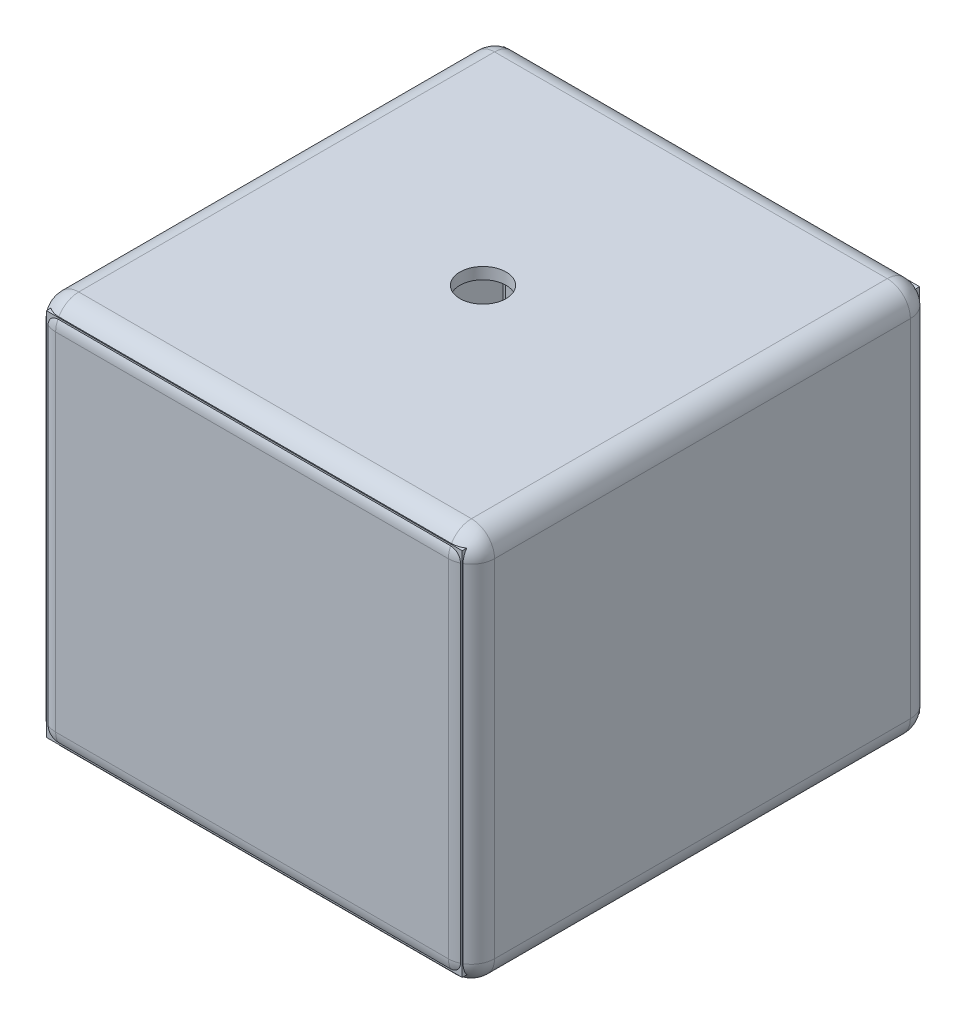
ISO-10303-21;
HEADER;
FILE_DESCRIPTION(('STEP AP214'),'2;1');
FILE_NAME('part.step','',(''),(''),'','','');
FILE_SCHEMA(('AUTOMOTIVE_DESIGN { 1 0 10303 214 1 1 1 1 }'));
ENDSEC;
DATA;
#1=APPLICATION_CONTEXT('core data for automotive mechanical design processes');
#2=APPLICATION_PROTOCOL_DEFINITION('international standard','automotive_design',2000,#1);
#3=PRODUCT_CONTEXT('',#1,'mechanical');
#4=PRODUCT('Part','Part','',(#3));
#5=PRODUCT_RELATED_PRODUCT_CATEGORY('part','',(#4));
#6=PRODUCT_DEFINITION_FORMATION('','',#4);
#7=PRODUCT_DEFINITION_CONTEXT('part definition',#1,'design');
#8=PRODUCT_DEFINITION('design','',#6,#7);
#9=PRODUCT_DEFINITION_SHAPE('','',#8);
#10=(LENGTH_UNIT() NAMED_UNIT(*) SI_UNIT(.MILLI.,.METRE.));
#11=(NAMED_UNIT(*) PLANE_ANGLE_UNIT() SI_UNIT($,.RADIAN.));
#12=(NAMED_UNIT(*) SI_UNIT($,.STERADIAN.) SOLID_ANGLE_UNIT());
#13=UNCERTAINTY_MEASURE_WITH_UNIT(LENGTH_MEASURE(1.E-05),#10,'distance_accuracy_value','');
#14=(GEOMETRIC_REPRESENTATION_CONTEXT(3) GLOBAL_UNCERTAINTY_ASSIGNED_CONTEXT((#13)) GLOBAL_UNIT_ASSIGNED_CONTEXT((#10,
#11,#12)) REPRESENTATION_CONTEXT('',''));
#15=CARTESIAN_POINT('',(0.,0.,0.));
#16=DIRECTION('',(0.,0.,1.));
#17=DIRECTION('',(1.,0.,0.));
#18=AXIS2_PLACEMENT_3D('',#15,#16,#17);
#19=CARTESIAN_POINT('',(95.,0.,200.));
#20=DIRECTION('',(-1.,0.,0.));
#21=DIRECTION('',(0.,0.,1.));
#22=AXIS2_PLACEMENT_3D('',#19,#20,#21);
#23=PLANE('',#22);
#24=DIRECTION('',(0.,0.,-1.));
#25=VECTOR('',#24,1.);
#26=CARTESIAN_POINT('',(95.,75.,200.));
#27=LINE('',#26,#25);
#28=CARTESIAN_POINT('',(95.,75.,10.));
#29=VERTEX_POINT('',#28);
#30=CARTESIAN_POINT('',(95.,75.,190.));
#31=VERTEX_POINT('',#30);
#32=EDGE_CURVE('E189',#29,#31,#27,.F.);
#33=ORIENTED_EDGE('',*,*,#32,.T.);
#34=DIRECTION('',(0.,1.,0.));
#35=VECTOR('',#34,1.);
#36=CARTESIAN_POINT('',(95.,-85.,190.));
#37=LINE('',#36,#35);
#38=CARTESIAN_POINT('',(95.,-75.,190.));
#39=VERTEX_POINT('',#38);
#40=EDGE_CURVE('E192',#31,#39,#37,.F.);
#41=ORIENTED_EDGE('',*,*,#40,.T.);
#42=DIRECTION('',(0.,0.,-1.));
#43=VECTOR('',#42,1.);
#44=CARTESIAN_POINT('',(95.,-75.,200.));
#45=LINE('',#44,#43);
#46=CARTESIAN_POINT('',(95.,-75.,10.));
#47=VERTEX_POINT('',#46);
#48=EDGE_CURVE('E187',#39,#47,#45,.T.);
#49=ORIENTED_EDGE('',*,*,#48,.T.);
#50=DIRECTION('',(0.,1.,0.));
#51=VECTOR('',#50,1.);
#52=CARTESIAN_POINT('',(95.,0.,10.));
#53=LINE('',#52,#51);
#54=EDGE_CURVE('E185',#47,#29,#53,.T.);
#55=ORIENTED_EDGE('',*,*,#54,.T.);
#56=EDGE_LOOP('',(#33,#41,#49,#55));
#57=FACE_BOUND('',#56,.T.);
#58=ADVANCED_FACE('F33',(#57),#23,.F.);
#59=CARTESIAN_POINT('',(0.,85.,200.));
#60=DIRECTION('',(0.,-1.,0.));
#61=DIRECTION('',(0.,0.,-1.));
#62=AXIS2_PLACEMENT_3D('',#59,#60,#61);
#63=PLANE('',#62);
#64=CARTESIAN_POINT('',(0.,85.,100.));
#65=DIRECTION('',(0.,1.,0.));
#66=DIRECTION('',(0.,0.,1.));
#67=AXIS2_PLACEMENT_3D('',#64,#65,#66);
#68=CIRCLE('',#67,10.);
#69=CARTESIAN_POINT('',(0.,85.,110.));
#70=VERTEX_POINT('',#69);
#71=EDGE_CURVE('E666',#70,#70,#68,.T.);
#72=ORIENTED_EDGE('',*,*,#71,.F.);
#73=EDGE_LOOP('',(#72));
#74=FACE_BOUND('',#73,.T.);
#75=DIRECTION('',(0.,0.,-1.));
#76=VECTOR('',#75,1.);
#77=CARTESIAN_POINT('',(-85.,85.,200.));
#78=LINE('',#77,#76);
#79=CARTESIAN_POINT('',(-85.,85.,10.));
#80=VERTEX_POINT('',#79);
#81=CARTESIAN_POINT('',(-85.,85.,190.));
#82=VERTEX_POINT('',#81);
#83=EDGE_CURVE('E173',#80,#82,#78,.F.);
#84=ORIENTED_EDGE('',*,*,#83,.T.);
#85=DIRECTION('',(-1.,0.,0.));
#86=VECTOR('',#85,1.);
#87=CARTESIAN_POINT('',(95.,85.,190.));
#88=LINE('',#87,#86);
#89=CARTESIAN_POINT('',(85.,85.,190.));
#90=VERTEX_POINT('',#89);
#91=EDGE_CURVE('E183',#82,#90,#88,.F.);
#92=ORIENTED_EDGE('',*,*,#91,.T.);
#93=DIRECTION('',(0.,0.,-1.));
#94=VECTOR('',#93,1.);
#95=CARTESIAN_POINT('',(85.,85.,200.));
#96=LINE('',#95,#94);
#97=CARTESIAN_POINT('',(85.,85.,10.));
#98=VERTEX_POINT('',#97);
#99=EDGE_CURVE('E180',#90,#98,#96,.T.);
#100=ORIENTED_EDGE('',*,*,#99,.T.);
#101=DIRECTION('',(-1.,0.,0.));
#102=VECTOR('',#101,1.);
#103=CARTESIAN_POINT('',(0.,85.,10.));
#104=LINE('',#103,#102);
#105=EDGE_CURVE('E170',#98,#80,#104,.T.);
#106=ORIENTED_EDGE('',*,*,#105,.T.);
#107=EDGE_LOOP('',(#84,#92,#100,#106));
#108=FACE_BOUND('',#107,.T.);
#109=ADVANCED_FACE('F321',(#74,#108),#63,.F.);
#110=CARTESIAN_POINT('',(-95.,0.,200.));
#111=DIRECTION('',(1.,0.,0.));
#112=DIRECTION('',(0.,0.,-1.));
#113=AXIS2_PLACEMENT_3D('',#110,#111,#112);
#114=PLANE('',#113);
#115=DIRECTION('',(0.,0.,-1.));
#116=VECTOR('',#115,1.);
#117=CARTESIAN_POINT('',(-95.,-75.,200.));
#118=LINE('',#117,#116);
#119=CARTESIAN_POINT('',(-95.,-75.,10.));
#120=VERTEX_POINT('',#119);
#121=CARTESIAN_POINT('',(-95.,-75.,190.));
#122=VERTEX_POINT('',#121);
#123=EDGE_CURVE('E205',#120,#122,#118,.F.);
#124=ORIENTED_EDGE('',*,*,#123,.T.);
#125=DIRECTION('',(0.,-1.,0.));
#126=VECTOR('',#125,1.);
#127=CARTESIAN_POINT('',(-95.,85.,190.));
#128=LINE('',#127,#126);
#129=CARTESIAN_POINT('',(-95.,75.,190.));
#130=VERTEX_POINT('',#129);
#131=EDGE_CURVE('E210',#122,#130,#128,.F.);
#132=ORIENTED_EDGE('',*,*,#131,.T.);
#133=DIRECTION('',(0.,0.,-1.));
#134=VECTOR('',#133,1.);
#135=CARTESIAN_POINT('',(-95.,75.,200.));
#136=LINE('',#135,#134);
#137=CARTESIAN_POINT('',(-95.,75.,10.));
#138=VERTEX_POINT('',#137);
#139=EDGE_CURVE('E207',#130,#138,#136,.T.);
#140=ORIENTED_EDGE('',*,*,#139,.T.);
#141=DIRECTION('',(0.,-1.,0.));
#142=VECTOR('',#141,1.);
#143=CARTESIAN_POINT('',(-95.,0.,10.));
#144=LINE('',#143,#142);
#145=EDGE_CURVE('E203',#138,#120,#144,.T.);
#146=ORIENTED_EDGE('',*,*,#145,.T.);
#147=EDGE_LOOP('',(#124,#132,#140,#146));
#148=FACE_BOUND('',#147,.T.);
#149=ADVANCED_FACE('F327',(#148),#114,.F.);
#150=CARTESIAN_POINT('',(0.,-85.,200.));
#151=DIRECTION('',(0.,1.,0.));
#152=DIRECTION('',(0.,0.,1.));
#153=AXIS2_PLACEMENT_3D('',#150,#151,#152);
#154=PLANE('',#153);
#155=DIRECTION('',(0.,0.,-1.));
#156=VECTOR('',#155,1.);
#157=CARTESIAN_POINT('',(85.,-85.,200.));
#158=LINE('',#157,#156);
#159=CARTESIAN_POINT('',(85.,-85.,10.));
#160=VERTEX_POINT('',#159);
#161=CARTESIAN_POINT('',(85.,-85.,190.));
#162=VERTEX_POINT('',#161);
#163=EDGE_CURVE('E198',#160,#162,#158,.F.);
#164=ORIENTED_EDGE('',*,*,#163,.T.);
#165=DIRECTION('',(1.,0.,0.));
#166=VECTOR('',#165,1.);
#167=CARTESIAN_POINT('',(-95.,-85.,190.));
#168=LINE('',#167,#166);
#169=CARTESIAN_POINT('',(-85.,-85.,190.));
#170=VERTEX_POINT('',#169);
#171=EDGE_CURVE('E201',#162,#170,#168,.F.);
#172=ORIENTED_EDGE('',*,*,#171,.T.);
#173=DIRECTION('',(0.,0.,-1.));
#174=VECTOR('',#173,1.);
#175=CARTESIAN_POINT('',(-85.,-85.,200.));
#176=LINE('',#175,#174);
#177=CARTESIAN_POINT('',(-85.,-85.,10.));
#178=VERTEX_POINT('',#177);
#179=EDGE_CURVE('E196',#170,#178,#176,.T.);
#180=ORIENTED_EDGE('',*,*,#179,.T.);
#181=DIRECTION('',(1.,0.,0.));
#182=VECTOR('',#181,1.);
#183=CARTESIAN_POINT('',(0.,-85.,10.));
#184=LINE('',#183,#182);
#185=EDGE_CURVE('E194',#178,#160,#184,.T.);
#186=ORIENTED_EDGE('',*,*,#185,.T.);
#187=EDGE_LOOP('',(#164,#172,#180,#186));
#188=FACE_BOUND('',#187,.T.);
#189=ADVANCED_FACE('F432',(#188),#154,.F.);
#190=CARTESIAN_POINT('',(0.,0.,200.));
#191=DIRECTION('',(0.,0.,1.));
#192=DIRECTION('',(1.,0.,0.));
#193=AXIS2_PLACEMENT_3D('',#190,#191,#192);
#194=PLANE('',#193);
#195=DIRECTION('',(0.,-1.,0.));
#196=VECTOR('',#195,1.);
#197=CARTESIAN_POINT('',(-85.,-85.,200.));
#198=LINE('',#197,#196);
#199=CARTESIAN_POINT('',(-85.,75.,200.));
#200=VERTEX_POINT('',#199);
#201=CARTESIAN_POINT('',(-85.,-75.,200.));
#202=VERTEX_POINT('',#201);
#203=EDGE_CURVE('E216',#200,#202,#198,.T.);
#204=ORIENTED_EDGE('',*,*,#203,.T.);
#205=DIRECTION('',(1.,0.,0.));
#206=VECTOR('',#205,1.);
#207=CARTESIAN_POINT('',(95.,-75.,200.));
#208=LINE('',#207,#206);
#209=CARTESIAN_POINT('',(85.,-75.,200.));
#210=VERTEX_POINT('',#209);
#211=EDGE_CURVE('E218',#202,#210,#208,.T.);
#212=ORIENTED_EDGE('',*,*,#211,.T.);
#213=DIRECTION('',(0.,1.,0.));
#214=VECTOR('',#213,1.);
#215=CARTESIAN_POINT('',(85.,85.,200.));
#216=LINE('',#215,#214);
#217=CARTESIAN_POINT('',(85.,75.,200.));
#218=VERTEX_POINT('',#217);
#219=EDGE_CURVE('E212',#210,#218,#216,.T.);
#220=ORIENTED_EDGE('',*,*,#219,.T.);
#221=DIRECTION('',(-1.,0.,0.));
#222=VECTOR('',#221,1.);
#223=CARTESIAN_POINT('',(-95.,75.,200.));
#224=LINE('',#223,#222);
#225=EDGE_CURVE('E214',#218,#200,#224,.T.);
#226=ORIENTED_EDGE('',*,*,#225,.T.);
#227=EDGE_LOOP('',(#204,#212,#220,#226));
#228=FACE_BOUND('',#227,.T.);
#229=ADVANCED_FACE('F441',(#228),#194,.T.);
#230=CARTESIAN_POINT('',(0.,0.,0.));
#231=DIRECTION('',(0.,0.,1.));
#232=DIRECTION('',(1.,0.,0.));
#233=AXIS2_PLACEMENT_3D('',#230,#231,#232);
#234=PLANE('',#233);
#235=DIRECTION('',(0.,-1.,0.));
#236=VECTOR('',#235,1.);
#237=CARTESIAN_POINT('',(-85.,0.,0.));
#238=LINE('',#237,#236);
#239=CARTESIAN_POINT('',(-85.,-75.,0.));
#240=VERTEX_POINT('',#239);
#241=CARTESIAN_POINT('',(-85.,75.,0.));
#242=VERTEX_POINT('',#241);
#243=EDGE_CURVE('E42',#240,#242,#238,.F.);
#244=ORIENTED_EDGE('',*,*,#243,.T.);
#245=DIRECTION('',(-1.,0.,0.));
#246=VECTOR('',#245,1.);
#247=CARTESIAN_POINT('',(0.,75.,0.));
#248=LINE('',#247,#246);
#249=CARTESIAN_POINT('',(85.,75.,0.));
#250=VERTEX_POINT('',#249);
#251=EDGE_CURVE('E11',#242,#250,#248,.F.);
#252=ORIENTED_EDGE('',*,*,#251,.T.);
#253=DIRECTION('',(0.,1.,0.));
#254=VECTOR('',#253,1.);
#255=CARTESIAN_POINT('',(85.,0.,0.));
#256=LINE('',#255,#254);
#257=CARTESIAN_POINT('',(85.,-75.,0.));
#258=VERTEX_POINT('',#257);
#259=EDGE_CURVE('E221',#250,#258,#256,.F.);
#260=ORIENTED_EDGE('',*,*,#259,.T.);
#261=DIRECTION('',(1.,0.,0.));
#262=VECTOR('',#261,1.);
#263=CARTESIAN_POINT('',(0.,-75.,0.));
#264=LINE('',#263,#262);
#265=EDGE_CURVE('E53',#258,#240,#264,.F.);
#266=ORIENTED_EDGE('',*,*,#265,.T.);
#267=EDGE_LOOP('',(#244,#252,#260,#266));
#268=FACE_BOUND('',#267,.T.);
#269=ADVANCED_FACE('F409',(#268),#234,.F.);
#270=CARTESIAN_POINT('',(-85.,-75.,200.));
#271=DIRECTION('',(0.,0.,-1.));
#272=DIRECTION('',(-1.,0.,0.));
#273=AXIS2_PLACEMENT_3D('',#270,#271,#272);
#274=CYLINDRICAL_SURFACE('',#273,10.);
#275=CARTESIAN_POINT('',(-85.,-75.,190.));
#276=DIRECTION('',(0.,0.,1.));
#277=DIRECTION('',(1.,0.,0.));
#278=AXIS2_PLACEMENT_3D('',#275,#276,#277);
#279=CIRCLE('',#278,10.);
#280=EDGE_CURVE('E287',#122,#170,#279,.T.);
#281=ORIENTED_EDGE('',*,*,#280,.F.);
#282=ORIENTED_EDGE('',*,*,#123,.F.);
#283=CARTESIAN_POINT('',(-85.,-75.,10.));
#284=DIRECTION('',(0.,0.,-1.));
#285=DIRECTION('',(-1.,0.,0.));
#286=AXIS2_PLACEMENT_3D('',#283,#284,#285);
#287=CIRCLE('',#286,10.);
#288=EDGE_CURVE('E285',#178,#120,#287,.T.);
#289=ORIENTED_EDGE('',*,*,#288,.F.);
#290=ORIENTED_EDGE('',*,*,#179,.F.);
#291=EDGE_LOOP('',(#281,#282,#289,#290));
#292=FACE_BOUND('',#291,.T.);
#293=ADVANCED_FACE('F35',(#292),#274,.T.);
#294=CARTESIAN_POINT('',(-85.,-75.,190.));
#295=DIRECTION('',(0.,0.,1.));
#296=DIRECTION('',(1.,0.,0.));
#297=AXIS2_PLACEMENT_3D('',#294,#295,#296);
#298=SPHERICAL_SURFACE('',#297,10.);
#299=CARTESIAN_POINT('',(-85.,-75.,190.));
#300=DIRECTION('',(0.,-1.,0.));
#301=DIRECTION('',(0.,0.,-1.));
#302=AXIS2_PLACEMENT_3D('',#299,#300,#301);
#303=CIRCLE('',#302,10.);
#304=EDGE_CURVE('E279',#122,#202,#303,.F.);
#305=ORIENTED_EDGE('',*,*,#304,.F.);
#306=ORIENTED_EDGE('',*,*,#280,.T.);
#307=CARTESIAN_POINT('',(-85.,-75.,190.));
#308=DIRECTION('',(-1.,0.,0.));
#309=DIRECTION('',(0.,0.,1.));
#310=AXIS2_PLACEMENT_3D('',#307,#308,#309);
#311=CIRCLE('',#310,10.);
#312=EDGE_CURVE('E282',#202,#170,#311,.F.);
#313=ORIENTED_EDGE('',*,*,#312,.F.);
#314=EDGE_LOOP('',(#305,#306,#313));
#315=FACE_BOUND('',#314,.T.);
#316=ADVANCED_FACE('F403',(#315),#298,.T.);
#317=CARTESIAN_POINT('',(-85.,-75.,10.));
#318=DIRECTION('',(0.,0.,1.));
#319=DIRECTION('',(1.,0.,0.));
#320=AXIS2_PLACEMENT_3D('',#317,#318,#319);
#321=SPHERICAL_SURFACE('',#320,10.);
#322=CARTESIAN_POINT('',(-85.,-75.,10.));
#323=DIRECTION('',(-1.,0.,0.));
#324=DIRECTION('',(0.,0.,1.));
#325=AXIS2_PLACEMENT_3D('',#322,#323,#324);
#326=CIRCLE('',#325,10.);
#327=EDGE_CURVE('E274',#178,#240,#326,.F.);
#328=ORIENTED_EDGE('',*,*,#327,.F.);
#329=ORIENTED_EDGE('',*,*,#288,.T.);
#330=CARTESIAN_POINT('',(-85.,-75.,10.));
#331=DIRECTION('',(0.,-1.,0.));
#332=DIRECTION('',(0.,0.,-1.));
#333=AXIS2_PLACEMENT_3D('',#330,#331,#332);
#334=CIRCLE('',#333,10.);
#335=EDGE_CURVE('E276',#240,#120,#334,.F.);
#336=ORIENTED_EDGE('',*,*,#335,.F.);
#337=EDGE_LOOP('',(#328,#329,#336));
#338=FACE_BOUND('',#337,.T.);
#339=ADVANCED_FACE('F400',(#338),#321,.T.);
#340=CARTESIAN_POINT('',(0.,-75.,190.));
#341=DIRECTION('',(-1.,0.,0.));
#342=DIRECTION('',(0.,0.,1.));
#343=AXIS2_PLACEMENT_3D('',#340,#341,#342);
#344=CYLINDRICAL_SURFACE('',#343,10.);
#345=ORIENTED_EDGE('',*,*,#312,.T.);
#346=ORIENTED_EDGE('',*,*,#171,.F.);
#347=CARTESIAN_POINT('',(85.,-75.,190.));
#348=DIRECTION('',(1.,0.,0.));
#349=DIRECTION('',(0.,0.,-1.));
#350=AXIS2_PLACEMENT_3D('',#347,#348,#349);
#351=CIRCLE('',#350,10.);
#352=EDGE_CURVE('E269',#210,#162,#351,.T.);
#353=ORIENTED_EDGE('',*,*,#352,.F.);
#354=ORIENTED_EDGE('',*,*,#211,.F.);
#355=EDGE_LOOP('',(#345,#346,#353,#354));
#356=FACE_BOUND('',#355,.T.);
#357=ADVANCED_FACE('F396',(#356),#344,.T.);
#358=CARTESIAN_POINT('',(-85.,0.,190.));
#359=DIRECTION('',(0.,1.,0.));
#360=DIRECTION('',(0.,0.,1.));
#361=AXIS2_PLACEMENT_3D('',#358,#359,#360);
#362=CYLINDRICAL_SURFACE('',#361,10.);
#363=ORIENTED_EDGE('',*,*,#304,.T.);
#364=ORIENTED_EDGE('',*,*,#203,.F.);
#365=CARTESIAN_POINT('',(-85.,75.,190.));
#366=DIRECTION('',(0.,1.,0.));
#367=DIRECTION('',(0.,0.,1.));
#368=AXIS2_PLACEMENT_3D('',#365,#366,#367);
#369=CIRCLE('',#368,10.);
#370=EDGE_CURVE('E266',#130,#200,#369,.T.);
#371=ORIENTED_EDGE('',*,*,#370,.F.);
#372=ORIENTED_EDGE('',*,*,#131,.F.);
#373=EDGE_LOOP('',(#363,#364,#371,#372));
#374=FACE_BOUND('',#373,.T.);
#375=ADVANCED_FACE('F392',(#374),#362,.T.);
#376=CARTESIAN_POINT('',(-85.,75.,200.));
#377=DIRECTION('',(0.,0.,-1.));
#378=DIRECTION('',(-1.,0.,0.));
#379=AXIS2_PLACEMENT_3D('',#376,#377,#378);
#380=CYLINDRICAL_SURFACE('',#379,10.);
#381=CARTESIAN_POINT('',(-85.,75.,10.));
#382=DIRECTION('',(0.,0.,-1.));
#383=DIRECTION('',(-1.,0.,0.));
#384=AXIS2_PLACEMENT_3D('',#381,#382,#383);
#385=CIRCLE('',#384,10.);
#386=EDGE_CURVE('E260',#138,#80,#385,.T.);
#387=ORIENTED_EDGE('',*,*,#386,.F.);
#388=ORIENTED_EDGE('',*,*,#139,.F.);
#389=CARTESIAN_POINT('',(-85.,75.,190.));
#390=DIRECTION('',(0.,0.,1.));
#391=DIRECTION('',(1.,0.,0.));
#392=AXIS2_PLACEMENT_3D('',#389,#390,#391);
#393=CIRCLE('',#392,10.);
#394=EDGE_CURVE('E263',#82,#130,#393,.T.);
#395=ORIENTED_EDGE('',*,*,#394,.F.);
#396=ORIENTED_EDGE('',*,*,#83,.F.);
#397=EDGE_LOOP('',(#387,#388,#395,#396));
#398=FACE_BOUND('',#397,.T.);
#399=ADVANCED_FACE('F388',(#398),#380,.T.);
#400=CARTESIAN_POINT('',(-85.,0.,10.));
#401=DIRECTION('',(0.,-1.,0.));
#402=DIRECTION('',(0.,0.,-1.));
#403=AXIS2_PLACEMENT_3D('',#400,#401,#402);
#404=CYLINDRICAL_SURFACE('',#403,10.);
#405=ORIENTED_EDGE('',*,*,#335,.T.);
#406=ORIENTED_EDGE('',*,*,#145,.F.);
#407=CARTESIAN_POINT('',(-85.,75.,10.));
#408=DIRECTION('',(0.,1.,0.));
#409=DIRECTION('',(0.,0.,1.));
#410=AXIS2_PLACEMENT_3D('',#407,#408,#409);
#411=CIRCLE('',#410,10.);
#412=EDGE_CURVE('E258',#242,#138,#411,.T.);
#413=ORIENTED_EDGE('',*,*,#412,.F.);
#414=ORIENTED_EDGE('',*,*,#243,.F.);
#415=EDGE_LOOP('',(#405,#406,#413,#414));
#416=FACE_BOUND('',#415,.T.);
#417=ADVANCED_FACE('F384',(#416),#404,.T.);
#418=CARTESIAN_POINT('',(0.,-75.,10.));
#419=DIRECTION('',(1.,0.,0.));
#420=DIRECTION('',(0.,0.,-1.));
#421=AXIS2_PLACEMENT_3D('',#418,#419,#420);
#422=CYLINDRICAL_SURFACE('',#421,10.);
#423=ORIENTED_EDGE('',*,*,#327,.T.);
#424=ORIENTED_EDGE('',*,*,#265,.F.);
#425=CARTESIAN_POINT('',(85.,-75.,10.));
#426=DIRECTION('',(1.,0.,0.));
#427=DIRECTION('',(0.,0.,-1.));
#428=AXIS2_PLACEMENT_3D('',#425,#426,#427);
#429=CIRCLE('',#428,10.);
#430=EDGE_CURVE('E255',#160,#258,#429,.T.);
#431=ORIENTED_EDGE('',*,*,#430,.F.);
#432=ORIENTED_EDGE('',*,*,#185,.F.);
#433=EDGE_LOOP('',(#423,#424,#431,#432));
#434=FACE_BOUND('',#433,.T.);
#435=ADVANCED_FACE('F380',(#434),#422,.T.);
#436=CARTESIAN_POINT('',(85.,-75.,200.));
#437=DIRECTION('',(0.,0.,-1.));
#438=DIRECTION('',(-1.,0.,0.));
#439=AXIS2_PLACEMENT_3D('',#436,#437,#438);
#440=CYLINDRICAL_SURFACE('',#439,10.);
#441=CARTESIAN_POINT('',(85.,-75.,190.));
#442=DIRECTION('',(0.,0.,1.));
#443=DIRECTION('',(1.,0.,0.));
#444=AXIS2_PLACEMENT_3D('',#441,#442,#443);
#445=CIRCLE('',#444,10.);
#446=EDGE_CURVE('E271',#162,#39,#445,.T.);
#447=ORIENTED_EDGE('',*,*,#446,.F.);
#448=ORIENTED_EDGE('',*,*,#163,.F.);
#449=CARTESIAN_POINT('',(85.,-75.,10.));
#450=DIRECTION('',(0.,0.,-1.));
#451=DIRECTION('',(-1.,0.,0.));
#452=AXIS2_PLACEMENT_3D('',#449,#450,#451);
#453=CIRCLE('',#452,10.);
#454=EDGE_CURVE('E252',#47,#160,#453,.T.);
#455=ORIENTED_EDGE('',*,*,#454,.F.);
#456=ORIENTED_EDGE('',*,*,#48,.F.);
#457=EDGE_LOOP('',(#447,#448,#455,#456));
#458=FACE_BOUND('',#457,.T.);
#459=ADVANCED_FACE('F376',(#458),#440,.T.);
#460=CARTESIAN_POINT('',(85.,-75.,190.));
#461=DIRECTION('',(0.,0.,1.));
#462=DIRECTION('',(1.,0.,0.));
#463=AXIS2_PLACEMENT_3D('',#460,#461,#462);
#464=SPHERICAL_SURFACE('',#463,10.);
#465=ORIENTED_EDGE('',*,*,#352,.T.);
#466=ORIENTED_EDGE('',*,*,#446,.T.);
#467=CARTESIAN_POINT('',(85.,-75.,190.));
#468=DIRECTION('',(0.,-1.,0.));
#469=DIRECTION('',(0.,0.,-1.));
#470=AXIS2_PLACEMENT_3D('',#467,#468,#469);
#471=CIRCLE('',#470,10.);
#472=EDGE_CURVE('E249',#210,#39,#471,.F.);
#473=ORIENTED_EDGE('',*,*,#472,.F.);
#474=EDGE_LOOP('',(#465,#466,#473));
#475=FACE_BOUND('',#474,.T.);
#476=ADVANCED_FACE('F372',(#475),#464,.T.);
#477=CARTESIAN_POINT('',(-85.,75.,190.));
#478=DIRECTION('',(0.,0.,1.));
#479=DIRECTION('',(1.,0.,0.));
#480=AXIS2_PLACEMENT_3D('',#477,#478,#479);
#481=SPHERICAL_SURFACE('',#480,10.);
#482=ORIENTED_EDGE('',*,*,#394,.T.);
#483=ORIENTED_EDGE('',*,*,#370,.T.);
#484=CARTESIAN_POINT('',(-85.,75.,190.));
#485=DIRECTION('',(-1.,0.,0.));
#486=DIRECTION('',(0.,0.,1.));
#487=AXIS2_PLACEMENT_3D('',#484,#485,#486);
#488=CIRCLE('',#487,10.);
#489=EDGE_CURVE('E246',#82,#200,#488,.F.);
#490=ORIENTED_EDGE('',*,*,#489,.F.);
#491=EDGE_LOOP('',(#482,#483,#490));
#492=FACE_BOUND('',#491,.T.);
#493=ADVANCED_FACE('F368',(#492),#481,.T.);
#494=CARTESIAN_POINT('',(-85.,75.,10.));
#495=DIRECTION('',(0.,0.,1.));
#496=DIRECTION('',(1.,0.,0.));
#497=AXIS2_PLACEMENT_3D('',#494,#495,#496);
#498=SPHERICAL_SURFACE('',#497,10.);
#499=ORIENTED_EDGE('',*,*,#412,.T.);
#500=ORIENTED_EDGE('',*,*,#386,.T.);
#501=CARTESIAN_POINT('',(-85.,75.,10.));
#502=DIRECTION('',(-1.,0.,0.));
#503=DIRECTION('',(0.,0.,1.));
#504=AXIS2_PLACEMENT_3D('',#501,#502,#503);
#505=CIRCLE('',#504,10.);
#506=EDGE_CURVE('E243',#242,#80,#505,.F.);
#507=ORIENTED_EDGE('',*,*,#506,.F.);
#508=EDGE_LOOP('',(#499,#500,#507));
#509=FACE_BOUND('',#508,.T.);
#510=ADVANCED_FACE('F364',(#509),#498,.T.);
#511=CARTESIAN_POINT('',(85.,-75.,10.));
#512=DIRECTION('',(0.,0.,1.));
#513=DIRECTION('',(1.,0.,0.));
#514=AXIS2_PLACEMENT_3D('',#511,#512,#513);
#515=SPHERICAL_SURFACE('',#514,10.);
#516=ORIENTED_EDGE('',*,*,#454,.T.);
#517=ORIENTED_EDGE('',*,*,#430,.T.);
#518=CARTESIAN_POINT('',(85.,-75.,10.));
#519=DIRECTION('',(0.,-1.,0.));
#520=DIRECTION('',(0.,0.,-1.));
#521=AXIS2_PLACEMENT_3D('',#518,#519,#520);
#522=CIRCLE('',#521,10.);
#523=EDGE_CURVE('E240',#47,#258,#522,.F.);
#524=ORIENTED_EDGE('',*,*,#523,.F.);
#525=EDGE_LOOP('',(#516,#517,#524));
#526=FACE_BOUND('',#525,.T.);
#527=ADVANCED_FACE('F360',(#526),#515,.T.);
#528=CARTESIAN_POINT('',(85.,0.,190.));
#529=DIRECTION('',(0.,-1.,0.));
#530=DIRECTION('',(0.,0.,-1.));
#531=AXIS2_PLACEMENT_3D('',#528,#529,#530);
#532=CYLINDRICAL_SURFACE('',#531,10.);
#533=ORIENTED_EDGE('',*,*,#472,.T.);
#534=ORIENTED_EDGE('',*,*,#40,.F.);
#535=CARTESIAN_POINT('',(85.,75.,190.));
#536=DIRECTION('',(0.,1.,0.));
#537=DIRECTION('',(0.,0.,1.));
#538=AXIS2_PLACEMENT_3D('',#535,#536,#537);
#539=CIRCLE('',#538,10.);
#540=EDGE_CURVE('E237',#218,#31,#539,.T.);
#541=ORIENTED_EDGE('',*,*,#540,.F.);
#542=ORIENTED_EDGE('',*,*,#219,.F.);
#543=EDGE_LOOP('',(#533,#534,#541,#542));
#544=FACE_BOUND('',#543,.T.);
#545=ADVANCED_FACE('F356',(#544),#532,.T.);
#546=CARTESIAN_POINT('',(0.,75.,190.));
#547=DIRECTION('',(1.,0.,0.));
#548=DIRECTION('',(0.,0.,-1.));
#549=AXIS2_PLACEMENT_3D('',#546,#547,#548);
#550=CYLINDRICAL_SURFACE('',#549,10.);
#551=ORIENTED_EDGE('',*,*,#489,.T.);
#552=ORIENTED_EDGE('',*,*,#225,.F.);
#553=CARTESIAN_POINT('',(85.,75.,190.));
#554=DIRECTION('',(1.,0.,0.));
#555=DIRECTION('',(0.,0.,-1.));
#556=AXIS2_PLACEMENT_3D('',#553,#554,#555);
#557=CIRCLE('',#556,10.);
#558=EDGE_CURVE('E234',#90,#218,#557,.T.);
#559=ORIENTED_EDGE('',*,*,#558,.F.);
#560=ORIENTED_EDGE('',*,*,#91,.F.);
#561=EDGE_LOOP('',(#551,#552,#559,#560));
#562=FACE_BOUND('',#561,.T.);
#563=ADVANCED_FACE('F352',(#562),#550,.T.);
#564=CARTESIAN_POINT('',(0.,75.,10.));
#565=DIRECTION('',(-1.,0.,0.));
#566=DIRECTION('',(0.,0.,1.));
#567=AXIS2_PLACEMENT_3D('',#564,#565,#566);
#568=CYLINDRICAL_SURFACE('',#567,10.);
#569=ORIENTED_EDGE('',*,*,#506,.T.);
#570=ORIENTED_EDGE('',*,*,#105,.F.);
#571=CARTESIAN_POINT('',(85.,75.,10.));
#572=DIRECTION('',(1.,0.,0.));
#573=DIRECTION('',(0.,0.,-1.));
#574=AXIS2_PLACEMENT_3D('',#571,#572,#573);
#575=CIRCLE('',#574,10.);
#576=EDGE_CURVE('E231',#250,#98,#575,.T.);
#577=ORIENTED_EDGE('',*,*,#576,.F.);
#578=ORIENTED_EDGE('',*,*,#251,.F.);
#579=EDGE_LOOP('',(#569,#570,#577,#578));
#580=FACE_BOUND('',#579,.T.);
#581=ADVANCED_FACE('F348',(#580),#568,.T.);
#582=CARTESIAN_POINT('',(85.,0.,10.));
#583=DIRECTION('',(0.,1.,0.));
#584=DIRECTION('',(0.,0.,1.));
#585=AXIS2_PLACEMENT_3D('',#582,#583,#584);
#586=CYLINDRICAL_SURFACE('',#585,10.);
#587=ORIENTED_EDGE('',*,*,#523,.T.);
#588=ORIENTED_EDGE('',*,*,#259,.F.);
#589=CARTESIAN_POINT('',(85.,75.,10.));
#590=DIRECTION('',(0.,1.,0.));
#591=DIRECTION('',(0.,0.,1.));
#592=AXIS2_PLACEMENT_3D('',#589,#590,#591);
#593=CIRCLE('',#592,10.);
#594=EDGE_CURVE('E229',#29,#250,#593,.T.);
#595=ORIENTED_EDGE('',*,*,#594,.F.);
#596=ORIENTED_EDGE('',*,*,#54,.F.);
#597=EDGE_LOOP('',(#587,#588,#595,#596));
#598=FACE_BOUND('',#597,.T.);
#599=ADVANCED_FACE('F344',(#598),#586,.T.);
#600=CARTESIAN_POINT('',(85.,75.,190.));
#601=DIRECTION('',(0.,0.,1.));
#602=DIRECTION('',(1.,0.,0.));
#603=AXIS2_PLACEMENT_3D('',#600,#601,#602);
#604=SPHERICAL_SURFACE('',#603,10.);
#605=ORIENTED_EDGE('',*,*,#558,.T.);
#606=ORIENTED_EDGE('',*,*,#540,.T.);
#607=CARTESIAN_POINT('',(85.,75.,190.));
#608=DIRECTION('',(0.,0.,1.));
#609=DIRECTION('',(1.,0.,0.));
#610=AXIS2_PLACEMENT_3D('',#607,#608,#609);
#611=CIRCLE('',#610,10.);
#612=EDGE_CURVE('E227',#90,#31,#611,.F.);
#613=ORIENTED_EDGE('',*,*,#612,.F.);
#614=EDGE_LOOP('',(#605,#606,#613));
#615=FACE_BOUND('',#614,.T.);
#616=ADVANCED_FACE('F340',(#615),#604,.T.);
#617=CARTESIAN_POINT('',(85.,75.,10.));
#618=DIRECTION('',(0.,0.,1.));
#619=DIRECTION('',(1.,0.,0.));
#620=AXIS2_PLACEMENT_3D('',#617,#618,#619);
#621=SPHERICAL_SURFACE('',#620,10.);
#622=ORIENTED_EDGE('',*,*,#594,.T.);
#623=ORIENTED_EDGE('',*,*,#576,.T.);
#624=CARTESIAN_POINT('',(85.,75.,10.));
#625=DIRECTION('',(0.,0.,-1.));
#626=DIRECTION('',(-1.,0.,0.));
#627=AXIS2_PLACEMENT_3D('',#624,#625,#626);
#628=CIRCLE('',#627,10.);
#629=EDGE_CURVE('E225',#29,#98,#628,.F.);
#630=ORIENTED_EDGE('',*,*,#629,.F.);
#631=EDGE_LOOP('',(#622,#623,#630));
#632=FACE_BOUND('',#631,.T.);
#633=ADVANCED_FACE('F336',(#632),#621,.T.);
#634=CARTESIAN_POINT('',(85.,75.,200.));
#635=DIRECTION('',(0.,0.,-1.));
#636=DIRECTION('',(-1.,0.,0.));
#637=AXIS2_PLACEMENT_3D('',#634,#635,#636);
#638=CYLINDRICAL_SURFACE('',#637,10.);
#639=ORIENTED_EDGE('',*,*,#612,.T.);
#640=ORIENTED_EDGE('',*,*,#32,.F.);
#641=ORIENTED_EDGE('',*,*,#629,.T.);
#642=ORIENTED_EDGE('',*,*,#99,.F.);
#643=EDGE_LOOP('',(#639,#640,#641,#642));
#644=FACE_BOUND('',#643,.T.);
#645=ADVANCED_FACE('F332',(#644),#638,.T.);
#646=CARTESIAN_POINT('',(0.,21.,100.));
#647=DIRECTION('',(0.,1.,0.));
#648=DIRECTION('',(0.,0.,1.));
#649=AXIS2_PLACEMENT_3D('',#646,#647,#648);
#650=CYLINDRICAL_SURFACE('',#649,10.);
#651=CARTESIAN_POINT('',(0.,80.,100.));
#652=DIRECTION('',(0.,-1.,0.));
#653=DIRECTION('',(0.,0.,-1.));
#654=AXIS2_PLACEMENT_3D('',#651,#652,#653);
#655=CIRCLE('',#654,10.);
#656=CARTESIAN_POINT('',(0.,80.,90.));
#657=VERTEX_POINT('',#656);
#658=EDGE_CURVE('E37',#657,#657,#655,.T.);
#659=ORIENTED_EDGE('',*,*,#658,.T.);
#660=EDGE_LOOP('',(#659));
#661=FACE_BOUND('',#660,.T.);
#662=ORIENTED_EDGE('',*,*,#71,.T.);
#663=EDGE_LOOP('',(#662));
#664=FACE_BOUND('',#663,.T.);
#665=ADVANCED_FACE('F335',(#661,#664),#650,.F.);
#666=CARTESIAN_POINT('',(90.,-80.,199.));
#667=DIRECTION('',(-1.,0.,0.));
#668=DIRECTION('',(0.,0.,1.));
#669=AXIS2_PLACEMENT_3D('',#666,#667,#668);
#670=PLANE('',#669);
#671=DIRECTION('',(0.,1.,0.));
#672=VECTOR('',#671,1.);
#673=CARTESIAN_POINT('',(90.,-80.,1.));
#674=LINE('',#673,#672);
#675=CARTESIAN_POINT('',(90.,-80.,1.));
#676=VERTEX_POINT('',#675);
#677=CARTESIAN_POINT('',(90.,80.,1.));
#678=VERTEX_POINT('',#677);
#679=EDGE_CURVE('E289',#676,#678,#674,.T.);
#680=ORIENTED_EDGE('',*,*,#679,.F.);
#681=DIRECTION('',(0.,0.,-1.));
#682=VECTOR('',#681,1.);
#683=CARTESIAN_POINT('',(90.,-80.,199.));
#684=LINE('',#683,#682);
#685=CARTESIAN_POINT('',(90.,-80.,199.));
#686=VERTEX_POINT('',#685);
#687=EDGE_CURVE('E165',#686,#676,#684,.T.);
#688=ORIENTED_EDGE('',*,*,#687,.F.);
#689=DIRECTION('',(0.,1.,0.));
#690=VECTOR('',#689,1.);
#691=CARTESIAN_POINT('',(90.,-80.,199.));
#692=LINE('',#691,#690);
#693=CARTESIAN_POINT('',(90.,80.,199.));
#694=VERTEX_POINT('',#693);
#695=EDGE_CURVE('E150',#686,#694,#692,.T.);
#696=ORIENTED_EDGE('',*,*,#695,.T.);
#697=DIRECTION('',(0.,0.,-1.));
#698=VECTOR('',#697,1.);
#699=CARTESIAN_POINT('',(90.,80.,199.));
#700=LINE('',#699,#698);
#701=EDGE_CURVE('E162',#694,#678,#700,.T.);
#702=ORIENTED_EDGE('',*,*,#701,.T.);
#703=EDGE_LOOP('',(#680,#688,#696,#702));
#704=FACE_BOUND('',#703,.T.);
#705=ADVANCED_FACE('F161',(#704),#670,.T.);
#706=CARTESIAN_POINT('',(-90.,80.,199.));
#707=DIRECTION('',(0.,-1.,0.));
#708=DIRECTION('',(0.,0.,-1.));
#709=AXIS2_PLACEMENT_3D('',#706,#707,#708);
#710=PLANE('',#709);
#711=ORIENTED_EDGE('',*,*,#658,.F.);
#712=EDGE_LOOP('',(#711));
#713=FACE_BOUND('',#712,.T.);
#714=DIRECTION('',(-1.,0.,0.));
#715=VECTOR('',#714,1.);
#716=CARTESIAN_POINT('',(-90.,80.,1.));
#717=LINE('',#716,#715);
#718=CARTESIAN_POINT('',(-90.,80.,1.));
#719=VERTEX_POINT('',#718);
#720=EDGE_CURVE('E169',#678,#719,#717,.T.);
#721=ORIENTED_EDGE('',*,*,#720,.F.);
#722=ORIENTED_EDGE('',*,*,#701,.F.);
#723=DIRECTION('',(-1.,0.,0.));
#724=VECTOR('',#723,1.);
#725=CARTESIAN_POINT('',(-90.,80.,199.));
#726=LINE('',#725,#724);
#727=CARTESIAN_POINT('',(-90.,80.,199.));
#728=VERTEX_POINT('',#727);
#729=EDGE_CURVE('E146',#694,#728,#726,.T.);
#730=ORIENTED_EDGE('',*,*,#729,.T.);
#731=DIRECTION('',(0.,0.,-1.));
#732=VECTOR('',#731,1.);
#733=CARTESIAN_POINT('',(-90.,80.,199.));
#734=LINE('',#733,#732);
#735=EDGE_CURVE('E171',#728,#719,#734,.T.);
#736=ORIENTED_EDGE('',*,*,#735,.T.);
#737=EDGE_LOOP('',(#721,#722,#730,#736));
#738=FACE_BOUND('',#737,.T.);
#739=ADVANCED_FACE('F168',(#713,#738),#710,.T.);
#740=CARTESIAN_POINT('',(-90.,-80.,199.));
#741=DIRECTION('',(1.,0.,0.));
#742=DIRECTION('',(0.,0.,-1.));
#743=AXIS2_PLACEMENT_3D('',#740,#741,#742);
#744=PLANE('',#743);
#745=DIRECTION('',(0.,-1.,0.));
#746=VECTOR('',#745,1.);
#747=CARTESIAN_POINT('',(-90.,-80.,1.));
#748=LINE('',#747,#746);
#749=CARTESIAN_POINT('',(-90.,-80.,1.));
#750=VERTEX_POINT('',#749);
#751=EDGE_CURVE('E296',#719,#750,#748,.T.);
#752=ORIENTED_EDGE('',*,*,#751,.F.);
#753=ORIENTED_EDGE('',*,*,#735,.F.);
#754=DIRECTION('',(0.,-1.,0.));
#755=VECTOR('',#754,1.);
#756=CARTESIAN_POINT('',(-90.,-80.,199.));
#757=LINE('',#756,#755);
#758=CARTESIAN_POINT('',(-90.,-80.,199.));
#759=VERTEX_POINT('',#758);
#760=EDGE_CURVE('E151',#728,#759,#757,.T.);
#761=ORIENTED_EDGE('',*,*,#760,.T.);
#762=DIRECTION('',(0.,0.,-1.));
#763=VECTOR('',#762,1.);
#764=CARTESIAN_POINT('',(-90.,-80.,199.));
#765=LINE('',#764,#763);
#766=EDGE_CURVE('E175',#759,#750,#765,.T.);
#767=ORIENTED_EDGE('',*,*,#766,.T.);
#768=EDGE_LOOP('',(#752,#753,#761,#767));
#769=FACE_BOUND('',#768,.T.);
#770=ADVANCED_FACE('F309',(#769),#744,.T.);
#771=CARTESIAN_POINT('',(-90.,-80.,199.));
#772=DIRECTION('',(0.,1.,0.));
#773=DIRECTION('',(0.,0.,1.));
#774=AXIS2_PLACEMENT_3D('',#771,#772,#773);
#775=PLANE('',#774);
#776=DIRECTION('',(1.,0.,0.));
#777=VECTOR('',#776,1.);
#778=CARTESIAN_POINT('',(-90.,-80.,1.));
#779=LINE('',#778,#777);
#780=EDGE_CURVE('E166',#750,#676,#779,.T.);
#781=ORIENTED_EDGE('',*,*,#780,.F.);
#782=ORIENTED_EDGE('',*,*,#766,.F.);
#783=DIRECTION('',(1.,0.,0.));
#784=VECTOR('',#783,1.);
#785=CARTESIAN_POINT('',(-90.,-80.,199.));
#786=LINE('',#785,#784);
#787=EDGE_CURVE('E299',#759,#686,#786,.T.);
#788=ORIENTED_EDGE('',*,*,#787,.T.);
#789=ORIENTED_EDGE('',*,*,#687,.T.);
#790=EDGE_LOOP('',(#781,#782,#788,#789));
#791=FACE_BOUND('',#790,.T.);
#792=ADVANCED_FACE('F311',(#791),#775,.T.);
#793=CARTESIAN_POINT('',(0.,0.,199.));
#794=DIRECTION('',(0.,0.,1.));
#795=DIRECTION('',(1.,0.,0.));
#796=AXIS2_PLACEMENT_3D('',#793,#794,#795);
#797=PLANE('',#796);
#798=ORIENTED_EDGE('',*,*,#695,.F.);
#799=ORIENTED_EDGE('',*,*,#787,.F.);
#800=ORIENTED_EDGE('',*,*,#760,.F.);
#801=ORIENTED_EDGE('',*,*,#729,.F.);
#802=EDGE_LOOP('',(#798,#799,#800,#801));
#803=FACE_BOUND('',#802,.T.);
#804=ADVANCED_FACE('F148',(#803),#797,.F.);
#805=CARTESIAN_POINT('',(0.,0.,1.));
#806=DIRECTION('',(0.,0.,1.));
#807=DIRECTION('',(1.,0.,0.));
#808=AXIS2_PLACEMENT_3D('',#805,#806,#807);
#809=PLANE('',#808);
#810=ORIENTED_EDGE('',*,*,#679,.T.);
#811=ORIENTED_EDGE('',*,*,#720,.T.);
#812=ORIENTED_EDGE('',*,*,#751,.T.);
#813=ORIENTED_EDGE('',*,*,#780,.T.);
#814=EDGE_LOOP('',(#810,#811,#812,#813));
#815=FACE_BOUND('',#814,.T.);
#816=ADVANCED_FACE('F312',(#815),#809,.T.);
#817=CLOSED_SHELL('',(#58,#109,#149,#189,#229,#269,#293,#316,#339,#357,#375,#399,#417,#435,#459,
#476,#493,#510,#527,#545,#563,#581,#599,#616,#633,#645,#665,#705,#739,#770,#792,#804,#816));
#818=MANIFOLD_SOLID_BREP('B2',#817);
#819=ADVANCED_BREP_SHAPE_REPRESENTATION('',(#18,#818),#14);
#820=SHAPE_DEFINITION_REPRESENTATION(#9,#819);
ENDSEC;
END-ISO-10303-21;
